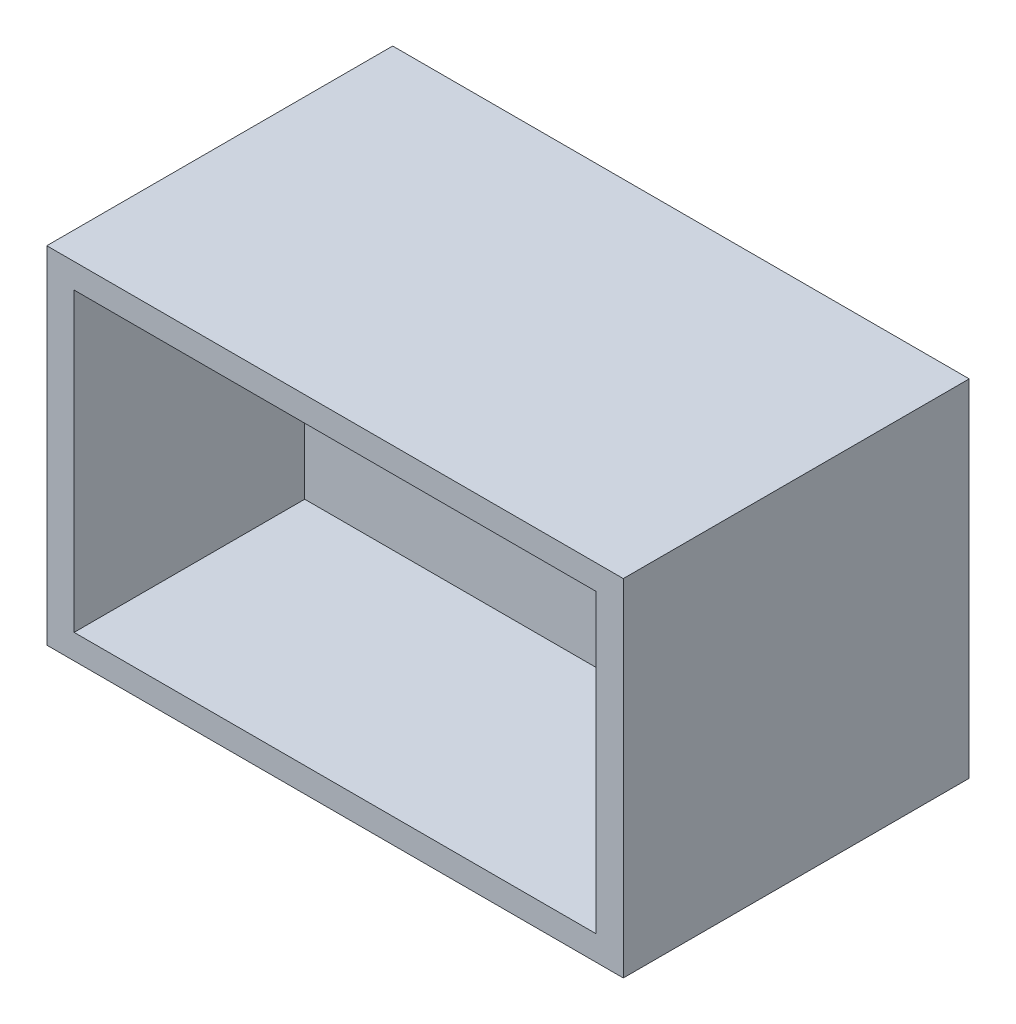
ISO-10303-21;
HEADER;
FILE_DESCRIPTION(('STEP AP214'),'2;1');
FILE_NAME('part.step','',(''),(''),'','','');
FILE_SCHEMA(('AUTOMOTIVE_DESIGN { 1 0 10303 214 1 1 1 1 }'));
ENDSEC;
DATA;
#1=APPLICATION_CONTEXT('core data for automotive mechanical design processes');
#2=APPLICATION_PROTOCOL_DEFINITION('international standard','automotive_design',2000,#1);
#3=PRODUCT_CONTEXT('',#1,'mechanical');
#4=PRODUCT('Part','Part','',(#3));
#5=PRODUCT_RELATED_PRODUCT_CATEGORY('part','',(#4));
#6=PRODUCT_DEFINITION_FORMATION('','',#4);
#7=PRODUCT_DEFINITION_CONTEXT('part definition',#1,'design');
#8=PRODUCT_DEFINITION('design','',#6,#7);
#9=PRODUCT_DEFINITION_SHAPE('','',#8);
#10=(LENGTH_UNIT() NAMED_UNIT(*) SI_UNIT(.MILLI.,.METRE.));
#11=(NAMED_UNIT(*) PLANE_ANGLE_UNIT() SI_UNIT($,.RADIAN.));
#12=(NAMED_UNIT(*) SI_UNIT($,.STERADIAN.) SOLID_ANGLE_UNIT());
#13=UNCERTAINTY_MEASURE_WITH_UNIT(LENGTH_MEASURE(1.E-05),#10,'distance_accuracy_value','');
#14=(GEOMETRIC_REPRESENTATION_CONTEXT(3) GLOBAL_UNCERTAINTY_ASSIGNED_CONTEXT((#13)) GLOBAL_UNIT_ASSIGNED_CONTEXT((#10,
#11,#12)) REPRESENTATION_CONTEXT('',''));
#15=CARTESIAN_POINT('',(0.,0.,0.));
#16=DIRECTION('',(0.,0.,1.));
#17=DIRECTION('',(1.,0.,0.));
#18=AXIS2_PLACEMENT_3D('',#15,#16,#17);
#19=CARTESIAN_POINT('',(3.15795707998067,-2.01220515179801,3.));
#20=DIRECTION('',(-1.,0.,0.));
#21=DIRECTION('',(0.,0.,1.));
#22=AXIS2_PLACEMENT_3D('',#19,#20,#21);
#23=PLANE('',#22);
#24=DIRECTION('',(0.,1.,0.));
#25=VECTOR('',#24,1.);
#26=CARTESIAN_POINT('',(3.15795707998067,-2.01220515179801,0.));
#27=LINE('',#26,#25);
#28=CARTESIAN_POINT('',(3.15795707998067,-2.01220515179801,0.));
#29=VERTEX_POINT('',#28);
#30=CARTESIAN_POINT('',(3.15795707998067,0.987794848201946,0.));
#31=VERTEX_POINT('',#30);
#32=EDGE_CURVE('E141',#29,#31,#27,.T.);
#33=ORIENTED_EDGE('',*,*,#32,.T.);
#34=DIRECTION('',(0.,0.,-1.));
#35=VECTOR('',#34,1.);
#36=CARTESIAN_POINT('',(3.15795707998067,0.987794848201946,3.));
#37=LINE('',#36,#35);
#38=CARTESIAN_POINT('',(3.15795707998067,0.987794848201946,3.));
#39=VERTEX_POINT('',#38);
#40=EDGE_CURVE('E11',#39,#31,#37,.T.);
#41=ORIENTED_EDGE('',*,*,#40,.F.);
#42=DIRECTION('',(0.,1.,0.));
#43=VECTOR('',#42,1.);
#44=CARTESIAN_POINT('',(3.15795707998067,-2.01220515179801,3.));
#45=LINE('',#44,#43);
#46=CARTESIAN_POINT('',(3.15795707998067,-2.01220515179801,3.));
#47=VERTEX_POINT('',#46);
#48=EDGE_CURVE('E145',#47,#39,#45,.T.);
#49=ORIENTED_EDGE('',*,*,#48,.F.);
#50=DIRECTION('',(0.,0.,-1.));
#51=VECTOR('',#50,1.);
#52=CARTESIAN_POINT('',(3.15795707998067,-2.01220515179801,3.));
#53=LINE('',#52,#51);
#54=EDGE_CURVE('E151',#47,#29,#53,.T.);
#55=ORIENTED_EDGE('',*,*,#54,.T.);
#56=EDGE_LOOP('',(#33,#41,#49,#55));
#57=FACE_BOUND('',#56,.T.);
#58=ADVANCED_FACE('F33',(#57),#23,.F.);
#59=CARTESIAN_POINT('',(-1.84204292001933,0.987794848201946,3.));
#60=DIRECTION('',(0.,-1.,0.));
#61=DIRECTION('',(0.,0.,-1.));
#62=AXIS2_PLACEMENT_3D('',#59,#60,#61);
#63=PLANE('',#62);
#64=DIRECTION('',(-1.,0.,0.));
#65=VECTOR('',#64,1.);
#66=CARTESIAN_POINT('',(-1.84204292001933,0.987794848201946,0.));
#67=LINE('',#66,#65);
#68=CARTESIAN_POINT('',(-1.84204292001933,0.987794848201946,0.));
#69=VERTEX_POINT('',#68);
#70=EDGE_CURVE('E154',#31,#69,#67,.T.);
#71=ORIENTED_EDGE('',*,*,#70,.T.);
#72=DIRECTION('',(0.,0.,-1.));
#73=VECTOR('',#72,1.);
#74=CARTESIAN_POINT('',(-1.84204292001933,0.987794848201946,3.));
#75=LINE('',#74,#73);
#76=CARTESIAN_POINT('',(-1.84204292001933,0.987794848201946,3.));
#77=VERTEX_POINT('',#76);
#78=EDGE_CURVE('E40',#77,#69,#75,.T.);
#79=ORIENTED_EDGE('',*,*,#78,.F.);
#80=DIRECTION('',(-1.,0.,0.));
#81=VECTOR('',#80,1.);
#82=CARTESIAN_POINT('',(-1.84204292001933,0.987794848201946,3.));
#83=LINE('',#82,#81);
#84=EDGE_CURVE('E84',#39,#77,#83,.T.);
#85=ORIENTED_EDGE('',*,*,#84,.F.);
#86=ORIENTED_EDGE('',*,*,#40,.T.);
#87=EDGE_LOOP('',(#71,#79,#85,#86));
#88=FACE_BOUND('',#87,.T.);
#89=ADVANCED_FACE('F183',(#88),#63,.F.);
#90=CARTESIAN_POINT('',(-1.84204292001933,-2.01220515179801,3.));
#91=DIRECTION('',(1.,0.,0.));
#92=DIRECTION('',(0.,0.,-1.));
#93=AXIS2_PLACEMENT_3D('',#90,#91,#92);
#94=PLANE('',#93);
#95=DIRECTION('',(0.,-1.,0.));
#96=VECTOR('',#95,1.);
#97=CARTESIAN_POINT('',(-1.84204292001933,-2.01220515179801,0.));
#98=LINE('',#97,#96);
#99=CARTESIAN_POINT('',(-1.84204292001933,-2.01220515179801,0.));
#100=VERTEX_POINT('',#99);
#101=EDGE_CURVE('E156',#69,#100,#98,.T.);
#102=ORIENTED_EDGE('',*,*,#101,.T.);
#103=DIRECTION('',(0.,0.,-1.));
#104=VECTOR('',#103,1.);
#105=CARTESIAN_POINT('',(-1.84204292001933,-2.01220515179801,3.));
#106=LINE('',#105,#104);
#107=CARTESIAN_POINT('',(-1.84204292001933,-2.01220515179801,3.));
#108=VERTEX_POINT('',#107);
#109=EDGE_CURVE('E160',#108,#100,#106,.T.);
#110=ORIENTED_EDGE('',*,*,#109,.F.);
#111=DIRECTION('',(0.,-1.,0.));
#112=VECTOR('',#111,1.);
#113=CARTESIAN_POINT('',(-1.84204292001933,-2.01220515179801,3.));
#114=LINE('',#113,#112);
#115=EDGE_CURVE('E148',#77,#108,#114,.T.);
#116=ORIENTED_EDGE('',*,*,#115,.F.);
#117=ORIENTED_EDGE('',*,*,#78,.T.);
#118=EDGE_LOOP('',(#102,#110,#116,#117));
#119=FACE_BOUND('',#118,.T.);
#120=ADVANCED_FACE('F165',(#119),#94,.F.);
#121=CARTESIAN_POINT('',(-1.84204292001933,-2.01220515179801,3.));
#122=DIRECTION('',(0.,1.,0.));
#123=DIRECTION('',(0.,0.,1.));
#124=AXIS2_PLACEMENT_3D('',#121,#122,#123);
#125=PLANE('',#124);
#126=DIRECTION('',(1.,0.,0.));
#127=VECTOR('',#126,1.);
#128=CARTESIAN_POINT('',(-1.84204292001933,-2.01220515179801,0.));
#129=LINE('',#128,#127);
#130=EDGE_CURVE('E77',#100,#29,#129,.T.);
#131=ORIENTED_EDGE('',*,*,#130,.T.);
#132=ORIENTED_EDGE('',*,*,#54,.F.);
#133=DIRECTION('',(1.,0.,0.));
#134=VECTOR('',#133,1.);
#135=CARTESIAN_POINT('',(-1.84204292001933,-2.01220515179801,3.));
#136=LINE('',#135,#134);
#137=EDGE_CURVE('E56',#108,#47,#136,.T.);
#138=ORIENTED_EDGE('',*,*,#137,.F.);
#139=ORIENTED_EDGE('',*,*,#109,.T.);
#140=EDGE_LOOP('',(#131,#132,#138,#139));
#141=FACE_BOUND('',#140,.T.);
#142=ADVANCED_FACE('F173',(#141),#125,.F.);
#143=CARTESIAN_POINT('',(0.,0.,3.));
#144=DIRECTION('',(0.,0.,-1.));
#145=DIRECTION('',(-1.,0.,0.));
#146=AXIS2_PLACEMENT_3D('',#143,#144,#145);
#147=PLANE('',#146);
#148=DIRECTION('',(-1.,0.,0.));
#149=VECTOR('',#148,1.);
#150=CARTESIAN_POINT('',(-1.60502832979559,0.773397670601758,3.));
#151=LINE('',#150,#149);
#152=CARTESIAN_POINT('',(2.92094248975694,0.773397670601758,3.));
#153=VERTEX_POINT('',#152);
#154=CARTESIAN_POINT('',(-1.60502832979559,0.773397670601758,3.));
#155=VERTEX_POINT('',#154);
#156=EDGE_CURVE('E135',#153,#155,#151,.T.);
#157=ORIENTED_EDGE('',*,*,#156,.F.);
#158=DIRECTION('',(0.,1.,0.));
#159=VECTOR('',#158,1.);
#160=CARTESIAN_POINT('',(2.92094248975694,-1.79780797419782,3.));
#161=LINE('',#160,#159);
#162=CARTESIAN_POINT('',(2.92094248975694,-1.79780797419782,3.));
#163=VERTEX_POINT('',#162);
#164=EDGE_CURVE('E47',#163,#153,#161,.T.);
#165=ORIENTED_EDGE('',*,*,#164,.F.);
#166=DIRECTION('',(1.,0.,0.));
#167=VECTOR('',#166,1.);
#168=CARTESIAN_POINT('',(-1.60502832979559,-1.79780797419782,3.));
#169=LINE('',#168,#167);
#170=CARTESIAN_POINT('',(-1.60502832979559,-1.79780797419782,3.));
#171=VERTEX_POINT('',#170);
#172=EDGE_CURVE('E126',#171,#163,#169,.T.);
#173=ORIENTED_EDGE('',*,*,#172,.F.);
#174=DIRECTION('',(0.,-1.,0.));
#175=VECTOR('',#174,1.);
#176=CARTESIAN_POINT('',(-1.60502832979559,-1.79780797419782,3.));
#177=LINE('',#176,#175);
#178=EDGE_CURVE('E129',#155,#171,#177,.T.);
#179=ORIENTED_EDGE('',*,*,#178,.F.);
#180=EDGE_LOOP('',(#157,#165,#173,#179));
#181=FACE_BOUND('',#180,.T.);
#182=ORIENTED_EDGE('',*,*,#48,.T.);
#183=ORIENTED_EDGE('',*,*,#84,.T.);
#184=ORIENTED_EDGE('',*,*,#115,.T.);
#185=ORIENTED_EDGE('',*,*,#137,.T.);
#186=EDGE_LOOP('',(#182,#183,#184,#185));
#187=FACE_BOUND('',#186,.T.);
#188=ADVANCED_FACE('F175',(#181,#187),#147,.F.);
#189=CARTESIAN_POINT('',(0.,0.,0.));
#190=DIRECTION('',(0.,0.,-1.));
#191=DIRECTION('',(-1.,0.,0.));
#192=AXIS2_PLACEMENT_3D('',#189,#190,#191);
#193=PLANE('',#192);
#194=ORIENTED_EDGE('',*,*,#32,.F.);
#195=ORIENTED_EDGE('',*,*,#130,.F.);
#196=ORIENTED_EDGE('',*,*,#101,.F.);
#197=ORIENTED_EDGE('',*,*,#70,.F.);
#198=EDGE_LOOP('',(#194,#195,#196,#197));
#199=FACE_BOUND('',#198,.T.);
#200=ADVANCED_FACE('F169',(#199),#193,.T.);
#201=CARTESIAN_POINT('',(2.92094248975694,-1.79780797419782,1.));
#202=DIRECTION('',(1.,0.,0.));
#203=DIRECTION('',(0.,0.,-1.));
#204=AXIS2_PLACEMENT_3D('',#201,#202,#203);
#205=PLANE('',#204);
#206=ORIENTED_EDGE('',*,*,#164,.T.);
#207=DIRECTION('',(0.,0.,1.));
#208=VECTOR('',#207,1.);
#209=CARTESIAN_POINT('',(2.92094248975694,0.773397670601758,1.));
#210=LINE('',#209,#208);
#211=CARTESIAN_POINT('',(2.92094248975694,0.773397670601758,1.));
#212=VERTEX_POINT('',#211);
#213=EDGE_CURVE('E104',#212,#153,#210,.T.);
#214=ORIENTED_EDGE('',*,*,#213,.F.);
#215=DIRECTION('',(0.,1.,0.));
#216=VECTOR('',#215,1.);
#217=CARTESIAN_POINT('',(2.92094248975694,-1.79780797419782,1.));
#218=LINE('',#217,#216);
#219=CARTESIAN_POINT('',(2.92094248975694,-1.79780797419782,1.));
#220=VERTEX_POINT('',#219);
#221=EDGE_CURVE('E108',#220,#212,#218,.T.);
#222=ORIENTED_EDGE('',*,*,#221,.F.);
#223=DIRECTION('',(0.,0.,1.));
#224=VECTOR('',#223,1.);
#225=CARTESIAN_POINT('',(2.92094248975694,-1.79780797419782,1.));
#226=LINE('',#225,#224);
#227=EDGE_CURVE('E139',#220,#163,#226,.T.);
#228=ORIENTED_EDGE('',*,*,#227,.T.);
#229=EDGE_LOOP('',(#206,#214,#222,#228));
#230=FACE_BOUND('',#229,.T.);
#231=ADVANCED_FACE('F106',(#230),#205,.F.);
#232=CARTESIAN_POINT('',(-1.60502832979559,-1.79780797419782,1.));
#233=DIRECTION('',(0.,-1.,0.));
#234=DIRECTION('',(0.,0.,-1.));
#235=AXIS2_PLACEMENT_3D('',#232,#233,#234);
#236=PLANE('',#235);
#237=ORIENTED_EDGE('',*,*,#172,.T.);
#238=ORIENTED_EDGE('',*,*,#227,.F.);
#239=DIRECTION('',(1.,0.,0.));
#240=VECTOR('',#239,1.);
#241=CARTESIAN_POINT('',(-1.60502832979559,-1.79780797419782,1.));
#242=LINE('',#241,#240);
#243=CARTESIAN_POINT('',(-1.60502832979559,-1.79780797419782,1.));
#244=VERTEX_POINT('',#243);
#245=EDGE_CURVE('E114',#244,#220,#242,.T.);
#246=ORIENTED_EDGE('',*,*,#245,.F.);
#247=DIRECTION('',(0.,0.,1.));
#248=VECTOR('',#247,1.);
#249=CARTESIAN_POINT('',(-1.60502832979559,-1.79780797419782,1.));
#250=LINE('',#249,#248);
#251=EDGE_CURVE('E142',#244,#171,#250,.T.);
#252=ORIENTED_EDGE('',*,*,#251,.T.);
#253=EDGE_LOOP('',(#237,#238,#246,#252));
#254=FACE_BOUND('',#253,.T.);
#255=ADVANCED_FACE('F222',(#254),#236,.F.);
#256=CARTESIAN_POINT('',(-1.60502832979559,-1.79780797419782,1.));
#257=DIRECTION('',(-1.,0.,0.));
#258=DIRECTION('',(0.,0.,1.));
#259=AXIS2_PLACEMENT_3D('',#256,#257,#258);
#260=PLANE('',#259);
#261=ORIENTED_EDGE('',*,*,#178,.T.);
#262=ORIENTED_EDGE('',*,*,#251,.F.);
#263=DIRECTION('',(0.,-1.,0.));
#264=VECTOR('',#263,1.);
#265=CARTESIAN_POINT('',(-1.60502832979559,-1.79780797419782,1.));
#266=LINE('',#265,#264);
#267=CARTESIAN_POINT('',(-1.60502832979559,0.773397670601758,1.));
#268=VERTEX_POINT('',#267);
#269=EDGE_CURVE('E122',#268,#244,#266,.T.);
#270=ORIENTED_EDGE('',*,*,#269,.F.);
#271=DIRECTION('',(0.,0.,1.));
#272=VECTOR('',#271,1.);
#273=CARTESIAN_POINT('',(-1.60502832979559,0.773397670601758,1.));
#274=LINE('',#273,#272);
#275=EDGE_CURVE('E113',#268,#155,#274,.T.);
#276=ORIENTED_EDGE('',*,*,#275,.T.);
#277=EDGE_LOOP('',(#261,#262,#270,#276));
#278=FACE_BOUND('',#277,.T.);
#279=ADVANCED_FACE('F231',(#278),#260,.F.);
#280=CARTESIAN_POINT('',(-1.60502832979559,0.773397670601758,1.));
#281=DIRECTION('',(0.,1.,0.));
#282=DIRECTION('',(0.,0.,1.));
#283=AXIS2_PLACEMENT_3D('',#280,#281,#282);
#284=PLANE('',#283);
#285=ORIENTED_EDGE('',*,*,#156,.T.);
#286=ORIENTED_EDGE('',*,*,#275,.F.);
#287=DIRECTION('',(-1.,0.,0.));
#288=VECTOR('',#287,1.);
#289=CARTESIAN_POINT('',(-1.60502832979559,0.773397670601758,1.));
#290=LINE('',#289,#288);
#291=EDGE_CURVE('E117',#212,#268,#290,.T.);
#292=ORIENTED_EDGE('',*,*,#291,.F.);
#293=ORIENTED_EDGE('',*,*,#213,.T.);
#294=EDGE_LOOP('',(#285,#286,#292,#293));
#295=FACE_BOUND('',#294,.T.);
#296=ADVANCED_FACE('F118',(#295),#284,.F.);
#297=CARTESIAN_POINT('',(0.,0.,1.));
#298=DIRECTION('',(0.,0.,-1.));
#299=DIRECTION('',(-1.,0.,0.));
#300=AXIS2_PLACEMENT_3D('',#297,#298,#299);
#301=PLANE('',#300);
#302=ORIENTED_EDGE('',*,*,#221,.T.);
#303=ORIENTED_EDGE('',*,*,#291,.T.);
#304=ORIENTED_EDGE('',*,*,#269,.T.);
#305=ORIENTED_EDGE('',*,*,#245,.T.);
#306=EDGE_LOOP('',(#302,#303,#304,#305));
#307=FACE_BOUND('',#306,.T.);
#308=ADVANCED_FACE('F124',(#307),#301,.F.);
#309=CLOSED_SHELL('',(#58,#89,#120,#142,#188,#200,#231,#255,#279,#296,#308));
#310=MANIFOLD_SOLID_BREP('B2',#309);
#311=ADVANCED_BREP_SHAPE_REPRESENTATION('',(#18,#310),#14);
#312=SHAPE_DEFINITION_REPRESENTATION(#9,#311);
ENDSEC;
END-ISO-10303-21;
